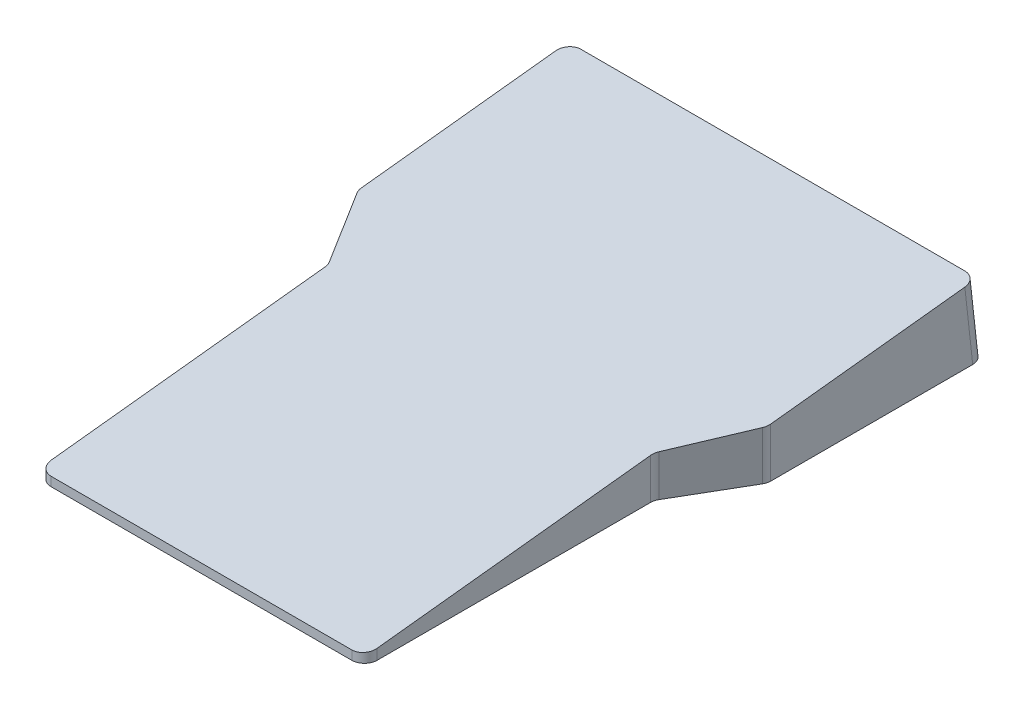
ISO-10303-21;
HEADER;
FILE_DESCRIPTION(('STEP AP214'),'2;1');
FILE_NAME('part.step','',(''),(''),'','','');
FILE_SCHEMA(('AUTOMOTIVE_DESIGN { 1 0 10303 214 1 1 1 1 }'));
ENDSEC;
DATA;
#1=APPLICATION_CONTEXT('core data for automotive mechanical design processes');
#2=APPLICATION_PROTOCOL_DEFINITION('international standard','automotive_design',2000,#1);
#3=PRODUCT_CONTEXT('',#1,'mechanical');
#4=PRODUCT('Part','Part','',(#3));
#5=PRODUCT_RELATED_PRODUCT_CATEGORY('part','',(#4));
#6=PRODUCT_DEFINITION_FORMATION('','',#4);
#7=PRODUCT_DEFINITION_CONTEXT('part definition',#1,'design');
#8=PRODUCT_DEFINITION('design','',#6,#7);
#9=PRODUCT_DEFINITION_SHAPE('','',#8);
#10=(LENGTH_UNIT() NAMED_UNIT(*) SI_UNIT(.MILLI.,.METRE.));
#11=(NAMED_UNIT(*) PLANE_ANGLE_UNIT() SI_UNIT($,.RADIAN.));
#12=(NAMED_UNIT(*) SI_UNIT($,.STERADIAN.) SOLID_ANGLE_UNIT());
#13=UNCERTAINTY_MEASURE_WITH_UNIT(LENGTH_MEASURE(1.E-05),#10,'distance_accuracy_value','');
#14=(GEOMETRIC_REPRESENTATION_CONTEXT(3) GLOBAL_UNCERTAINTY_ASSIGNED_CONTEXT((#13)) GLOBAL_UNIT_ASSIGNED_CONTEXT((#10,
#11,#12)) REPRESENTATION_CONTEXT('',''));
#15=CARTESIAN_POINT('',(0.,0.,0.));
#16=DIRECTION('',(0.,0.,1.));
#17=DIRECTION('',(1.,0.,0.));
#18=AXIS2_PLACEMENT_3D('',#15,#16,#17);
#19=CARTESIAN_POINT('',(0.,0.,0.));
#20=DIRECTION('',(0.,1.,0.));
#21=DIRECTION('',(0.,0.,1.));
#22=AXIS2_PLACEMENT_3D('',#19,#20,#21);
#23=PLANE('',#22);
#24=CARTESIAN_POINT('',(-49.597316240606,0.,6.94413092550791));
#25=DIRECTION('',(0.,1.,0.));
#26=DIRECTION('',(0.,0.,1.));
#27=AXIS2_PLACEMENT_3D('',#24,#25,#26);
#28=CIRCLE('',#27,2.35);
#29=CARTESIAN_POINT('',(-49.597316240606,0.,9.2941309255079));
#30=VERTEX_POINT('',#29);
#31=EDGE_CURVE('E286',#30,#30,#28,.F.);
#32=ORIENTED_EDGE('',*,*,#31,.F.);
#33=EDGE_LOOP('',(#32));
#34=FACE_BOUND('',#33,.T.);
#35=CARTESIAN_POINT('',(47.402683759394,0.,6.94413092550789));
#36=DIRECTION('',(0.,1.,0.));
#37=DIRECTION('',(0.,0.,1.));
#38=AXIS2_PLACEMENT_3D('',#35,#36,#37);
#39=CIRCLE('',#38,2.35);
#40=CARTESIAN_POINT('',(47.402683759394,0.,9.29413092550789));
#41=VERTEX_POINT('',#40);
#42=EDGE_CURVE('E457',#41,#41,#39,.F.);
#43=ORIENTED_EDGE('',*,*,#42,.F.);
#44=EDGE_LOOP('',(#43));
#45=FACE_BOUND('',#44,.T.);
#46=CARTESIAN_POINT('',(-21.847316240606,0.,-5.13086907449209));
#47=DIRECTION('',(0.,1.,0.));
#48=DIRECTION('',(0.,0.,1.));
#49=AXIS2_PLACEMENT_3D('',#46,#47,#48);
#50=CIRCLE('',#49,2.4);
#51=CARTESIAN_POINT('',(-21.847316240606,0.,-2.73086907449209));
#52=VERTEX_POINT('',#51);
#53=EDGE_CURVE('E453',#52,#52,#50,.F.);
#54=ORIENTED_EDGE('',*,*,#53,.F.);
#55=EDGE_LOOP('',(#54));
#56=FACE_BOUND('',#55,.T.);
#57=CARTESIAN_POINT('',(-31.847316240606,0.,-5.1308690744921));
#58=DIRECTION('',(0.,1.,0.));
#59=DIRECTION('',(0.,0.,1.));
#60=AXIS2_PLACEMENT_3D('',#57,#58,#59);
#61=CIRCLE('',#60,2.4);
#62=CARTESIAN_POINT('',(-31.847316240606,0.,-2.7308690744921));
#63=VERTEX_POINT('',#62);
#64=EDGE_CURVE('E449',#63,#63,#61,.F.);
#65=ORIENTED_EDGE('',*,*,#64,.F.);
#66=EDGE_LOOP('',(#65));
#67=FACE_BOUND('',#66,.T.);
#68=CARTESIAN_POINT('',(48.902683759394,0.,-45.3058690744921));
#69=DIRECTION('',(0.,1.,0.));
#70=DIRECTION('',(0.,0.,1.));
#71=AXIS2_PLACEMENT_3D('',#68,#69,#70);
#72=CIRCLE('',#71,2.4);
#73=CARTESIAN_POINT('',(48.902683759394,0.,-42.9058690744921));
#74=VERTEX_POINT('',#73);
#75=EDGE_CURVE('E445',#74,#74,#72,.F.);
#76=ORIENTED_EDGE('',*,*,#75,.F.);
#77=EDGE_LOOP('',(#76));
#78=FACE_BOUND('',#77,.T.);
#79=CARTESIAN_POINT('',(-51.097316240606,0.,-45.3058690744921));
#80=DIRECTION('',(0.,1.,0.));
#81=DIRECTION('',(0.,0.,1.));
#82=AXIS2_PLACEMENT_3D('',#79,#80,#81);
#83=CIRCLE('',#82,2.4);
#84=CARTESIAN_POINT('',(-51.097316240606,0.,-42.9058690744921));
#85=VERTEX_POINT('',#84);
#86=EDGE_CURVE('E441',#85,#85,#83,.F.);
#87=ORIENTED_EDGE('',*,*,#86,.F.);
#88=EDGE_LOOP('',(#87));
#89=FACE_BOUND('',#88,.T.);
#90=DIRECTION('',(1.,0.,0.));
#91=VECTOR('',#90,1.);
#92=CARTESIAN_POINT('',(0.,0.,-51.8058690744921));
#93=LINE('',#92,#91);
#94=CARTESIAN_POINT('',(-54.097316240606,0.,-51.8058690744921));
#95=VERTEX_POINT('',#94);
#96=CARTESIAN_POINT('',(51.902683759394,0.,-51.8058690744921));
#97=VERTEX_POINT('',#96);
#98=EDGE_CURVE('E253',#95,#97,#93,.T.);
#99=ORIENTED_EDGE('',*,*,#98,.T.);
#100=CARTESIAN_POINT('',(51.902683759394,0.,-48.2844070286295));
#101=DIRECTION('',(0.,1.,0.));
#102=DIRECTION('',(0.,0.,1.));
#103=AXIS2_PLACEMENT_3D('',#100,#101,#102);
#104=ELLIPSE('',#103,3.52146204586261,3.5);
#105=CARTESIAN_POINT('',(55.402683759394,0.,-48.2844070286295));
#106=VERTEX_POINT('',#105);
#107=EDGE_CURVE('E261',#97,#106,#104,.F.);
#108=ORIENTED_EDGE('',*,*,#107,.T.);
#109=DIRECTION('',(0.,0.,1.));
#110=VECTOR('',#109,1.);
#111=CARTESIAN_POINT('',(55.402683759394,0.,0.));
#112=LINE('',#111,#110);
#113=CARTESIAN_POINT('',(55.402683759394,0.,7.49938743866031));
#114=VERTEX_POINT('',#113);
#115=EDGE_CURVE('E273',#106,#114,#112,.T.);
#116=ORIENTED_EDGE('',*,*,#115,.T.);
#117=CARTESIAN_POINT('',(51.902683759394,0.,7.49938743866031));
#118=DIRECTION('',(0.,1.,0.));
#119=DIRECTION('',(0.,0.,1.));
#120=AXIS2_PLACEMENT_3D('',#117,#118,#119);
#121=CIRCLE('',#120,3.5);
#122=CARTESIAN_POINT('',(54.927297595843,0.,9.2605549889977));
#123=VERTEX_POINT('',#122);
#124=EDGE_CURVE('E283',#114,#123,#121,.F.);
#125=ORIENTED_EDGE('',*,*,#124,.T.);
#126=DIRECTION('',(0.503190728667824,0.,-0.864175381842566));
#127=VECTOR('',#126,1.);
#128=CARTESIAN_POINT('',(45.0465622981541,0.,26.2296438698113));
#129=LINE('',#128,#127);
#130=CARTESIAN_POINT('',(44.378069922945,0.,27.3777068620181));
#131=VERTEX_POINT('',#130);
#132=EDGE_CURVE('E376',#131,#123,#129,.T.);
#133=ORIENTED_EDGE('',*,*,#132,.F.);
#134=CARTESIAN_POINT('',(47.402683759394,0.,29.1388744123555));
#135=DIRECTION('',(0.,1.,0.));
#136=DIRECTION('',(0.,0.,1.));
#137=AXIS2_PLACEMENT_3D('',#134,#135,#136);
#138=CIRCLE('',#137,3.5);
#139=CARTESIAN_POINT('',(43.902683759394,0.,29.1388744123555));
#140=VERTEX_POINT('',#139);
#141=EDGE_CURVE('E146',#131,#140,#138,.T.);
#142=ORIENTED_EDGE('',*,*,#141,.T.);
#143=DIRECTION('',(0.,0.,1.));
#144=VECTOR('',#143,1.);
#145=CARTESIAN_POINT('',(43.902683759394,0.,0.));
#146=LINE('',#145,#144);
#147=CARTESIAN_POINT('',(43.902683759394,0.,104.694130925508));
#148=VERTEX_POINT('',#147);
#149=EDGE_CURVE('E375',#140,#148,#146,.T.);
#150=ORIENTED_EDGE('',*,*,#149,.T.);
#151=CARTESIAN_POINT('',(40.402683759394,0.,104.694130925508));
#152=DIRECTION('',(0.,1.,0.));
#153=DIRECTION('',(0.,0.,1.));
#154=AXIS2_PLACEMENT_3D('',#151,#152,#153);
#155=CIRCLE('',#154,3.5);
#156=CARTESIAN_POINT('',(40.402683759394,0.,108.194130925508));
#157=VERTEX_POINT('',#156);
#158=EDGE_CURVE('E292',#148,#157,#155,.F.);
#159=ORIENTED_EDGE('',*,*,#158,.T.);
#160=DIRECTION('',(1.,0.,0.));
#161=VECTOR('',#160,1.);
#162=CARTESIAN_POINT('',(0.,0.,108.194130925508));
#163=LINE('',#162,#161);
#164=CARTESIAN_POINT('',(-42.597316240606,0.,108.194130925508));
#165=VERTEX_POINT('',#164);
#166=EDGE_CURVE('E385',#165,#157,#163,.T.);
#167=ORIENTED_EDGE('',*,*,#166,.F.);
#168=CARTESIAN_POINT('',(-42.597316240606,0.,104.694130925508));
#169=DIRECTION('',(0.,1.,0.));
#170=DIRECTION('',(0.,0.,1.));
#171=AXIS2_PLACEMENT_3D('',#168,#169,#170);
#172=CIRCLE('',#171,3.5);
#173=CARTESIAN_POINT('',(-46.097316240606,0.,104.694130925508));
#174=VERTEX_POINT('',#173);
#175=EDGE_CURVE('E295',#165,#174,#172,.F.);
#176=ORIENTED_EDGE('',*,*,#175,.T.);
#177=DIRECTION('',(0.,0.,1.));
#178=VECTOR('',#177,1.);
#179=CARTESIAN_POINT('',(-46.097316240606,0.,0.));
#180=LINE('',#179,#178);
#181=CARTESIAN_POINT('',(-46.097316240606,0.,29.1388744123555));
#182=VERTEX_POINT('',#181);
#183=EDGE_CURVE('E432',#182,#174,#180,.T.);
#184=ORIENTED_EDGE('',*,*,#183,.F.);
#185=CARTESIAN_POINT('',(-49.597316240606,0.,29.1388744123555));
#186=DIRECTION('',(0.,1.,0.));
#187=DIRECTION('',(0.,0.,1.));
#188=AXIS2_PLACEMENT_3D('',#185,#186,#187);
#189=CIRCLE('',#188,3.5);
#190=CARTESIAN_POINT('',(-46.572702404157,0.,27.3777068620181));
#191=VERTEX_POINT('',#190);
#192=EDGE_CURVE('E366',#182,#191,#189,.T.);
#193=ORIENTED_EDGE('',*,*,#192,.T.);
#194=DIRECTION('',(0.503190728667823,0.,0.864175381842566));
#195=VECTOR('',#194,1.);
#196=CARTESIAN_POINT('',(-46.6855118392866,0.,27.1839689190783));
#197=LINE('',#196,#195);
#198=CARTESIAN_POINT('',(-57.121930077055,0.,9.2605549889977));
#199=VERTEX_POINT('',#198);
#200=EDGE_CURVE('E428',#199,#191,#197,.T.);
#201=ORIENTED_EDGE('',*,*,#200,.F.);
#202=CARTESIAN_POINT('',(-54.097316240606,0.,7.49938743866033));
#203=DIRECTION('',(0.,1.,0.));
#204=DIRECTION('',(0.,0.,1.));
#205=AXIS2_PLACEMENT_3D('',#202,#203,#204);
#206=CIRCLE('',#205,3.5);
#207=CARTESIAN_POINT('',(-57.597316240606,0.,7.49938743866033));
#208=VERTEX_POINT('',#207);
#209=EDGE_CURVE('E262',#199,#208,#206,.F.);
#210=ORIENTED_EDGE('',*,*,#209,.T.);
#211=DIRECTION('',(0.,0.,1.));
#212=VECTOR('',#211,1.);
#213=CARTESIAN_POINT('',(-57.597316240606,0.,0.));
#214=LINE('',#213,#212);
#215=CARTESIAN_POINT('',(-57.597316240606,0.,-48.2844070286295));
#216=VERTEX_POINT('',#215);
#217=EDGE_CURVE('E255',#216,#208,#214,.T.);
#218=ORIENTED_EDGE('',*,*,#217,.F.);
#219=CARTESIAN_POINT('',(-54.097316240606,0.,-48.2844070286295));
#220=DIRECTION('',(0.,1.,0.));
#221=DIRECTION('',(0.,0.,-1.));
#222=AXIS2_PLACEMENT_3D('',#219,#220,#221);
#223=ELLIPSE('',#222,3.52146204586261,3.5);
#224=EDGE_CURVE('E251',#216,#95,#223,.F.);
#225=ORIENTED_EDGE('',*,*,#224,.T.);
#226=EDGE_LOOP('',(#99,#108,#116,#125,#133,#142,#150,#159,#167,#176,#184,#193,#201,#210,#218,#225));
#227=FACE_BOUND('',#226,.T.);
#228=ADVANCED_FACE('F137',(#34,#45,#56,#67,#78,#89,#227),#23,.F.);
#229=CARTESIAN_POINT('',(45.0465622981541,20.,26.2296438698113));
#230=DIRECTION('',(-0.864175381842566,0.,-0.503190728667824));
#231=DIRECTION('',(-0.503190728667824,0.,0.864175381842566));
#232=AXIS2_PLACEMENT_3D('',#229,#230,#231);
#233=PLANE('',#232);
#234=DIRECTION('',(-0.500895165872153,-0.0954107678980578,0.860233002258697));
#235=VECTOR('',#234,1.);
#236=CARTESIAN_POINT('',(45.4484397145102,11.6674526644309,25.5394630895475));
#237=LINE('',#236,#235);
#238=CARTESIAN_POINT('',(54.927297595843,13.4729903714675,9.2605549889977));
#239=VERTEX_POINT('',#238);
#240=CARTESIAN_POINT('',(44.378069922945,11.463568077982,27.3777068620181));
#241=VERTEX_POINT('',#240);
#242=EDGE_CURVE('E389',#239,#241,#237,.T.);
#243=ORIENTED_EDGE('',*,*,#242,.T.);
#244=DIRECTION('',(0.,-1.,0.));
#245=VECTOR('',#244,1.);
#246=CARTESIAN_POINT('',(44.378069922945,20.,27.3777068620181));
#247=LINE('',#246,#245);
#248=EDGE_CURVE('E362',#241,#131,#247,.T.);
#249=ORIENTED_EDGE('',*,*,#248,.T.);
#250=ORIENTED_EDGE('',*,*,#132,.T.);
#251=DIRECTION('',(0.,-1.,0.));
#252=VECTOR('',#251,1.);
#253=CARTESIAN_POINT('',(54.927297595843,13.5635421715304,9.2605549889977));
#254=LINE('',#253,#252);
#255=EDGE_CURVE('E158',#123,#239,#254,.F.);
#256=ORIENTED_EDGE('',*,*,#255,.T.);
#257=EDGE_LOOP('',(#243,#249,#250,#256));
#258=FACE_BOUND('',#257,.T.);
#259=ADVANCED_FACE('F388',(#258),#233,.F.);
#260=CARTESIAN_POINT('',(-57.597316240606,20.,0.));
#261=DIRECTION('',(1.,0.,0.));
#262=DIRECTION('',(0.,0.,-1.));
#263=AXIS2_PLACEMENT_3D('',#260,#261,#262);
#264=PLANE('',#263);
#265=DIRECTION('',(0.,0.110236730398686,-0.993905359312952));
#266=VECTOR('',#265,1.);
#267=CARTESIAN_POINT('',(-57.5973162406061,14.3238963199093,1.58870206512229));
#268=LINE('',#267,#266);
#269=CARTESIAN_POINT('',(-57.5973162406061,13.6683262257461,7.49938743866033));
#270=VERTEX_POINT('',#269);
#271=CARTESIAN_POINT('',(-57.5973162406061,19.6141714436046,-46.1089462474171));
#272=VERTEX_POINT('',#271);
#273=EDGE_CURVE('E553',#270,#272,#268,.T.);
#274=ORIENTED_EDGE('',*,*,#273,.T.);
#275=DIRECTION('',(0.,-0.993905359312952,-0.110236730398682));
#276=VECTOR('',#275,1.);
#277=CARTESIAN_POINT('',(-57.597316240606,25.0472323891153,-45.5063507698115));
#278=LINE('',#277,#276);
#279=EDGE_CURVE('E329',#272,#216,#278,.T.);
#280=ORIENTED_EDGE('',*,*,#279,.T.);
#281=ORIENTED_EDGE('',*,*,#217,.T.);
#282=DIRECTION('',(0.,-1.,0.));
#283=VECTOR('',#282,1.);
#284=CARTESIAN_POINT('',(-57.597316240606,20.,7.49938743866033));
#285=LINE('',#284,#283);
#286=EDGE_CURVE('E326',#208,#270,#285,.F.);
#287=ORIENTED_EDGE('',*,*,#286,.T.);
#288=EDGE_LOOP('',(#274,#280,#281,#287));
#289=FACE_BOUND('',#288,.T.);
#290=ADVANCED_FACE('F498',(#289),#264,.F.);
#291=CARTESIAN_POINT('',(55.402683759394,20.,0.));
#292=DIRECTION('',(1.,0.,0.));
#293=DIRECTION('',(0.,0.,-1.));
#294=AXIS2_PLACEMENT_3D('',#291,#292,#293);
#295=PLANE('',#294);
#296=ORIENTED_EDGE('',*,*,#115,.F.);
#297=DIRECTION('',(0.,-0.993905359312952,-0.110236730398682));
#298=VECTOR('',#297,1.);
#299=CARTESIAN_POINT('',(55.402683759394,19.6141714436046,-46.1089462474171));
#300=LINE('',#299,#298);
#301=CARTESIAN_POINT('',(55.402683759394,19.6141714436046,-46.1089462474171));
#302=VERTEX_POINT('',#301);
#303=EDGE_CURVE('E306',#106,#302,#300,.F.);
#304=ORIENTED_EDGE('',*,*,#303,.T.);
#305=DIRECTION('',(0.,0.110236730398686,-0.993905359312952));
#306=VECTOR('',#305,1.);
#307=CARTESIAN_POINT('',(55.402683759394,14.3238963199093,1.58870206512224));
#308=LINE('',#307,#306);
#309=CARTESIAN_POINT('',(55.402683759394,13.6683262257461,7.49938743866031));
#310=VERTEX_POINT('',#309);
#311=EDGE_CURVE('E548',#310,#302,#308,.T.);
#312=ORIENTED_EDGE('',*,*,#311,.F.);
#313=DIRECTION('',(0.,-1.,0.));
#314=VECTOR('',#313,1.);
#315=CARTESIAN_POINT('',(55.402683759394,0.,7.49938743866031));
#316=LINE('',#315,#314);
#317=EDGE_CURVE('E302',#310,#114,#316,.T.);
#318=ORIENTED_EDGE('',*,*,#317,.T.);
#319=EDGE_LOOP('',(#296,#304,#312,#318));
#320=FACE_BOUND('',#319,.T.);
#321=ADVANCED_FACE('F485',(#320),#295,.T.);
#322=CARTESIAN_POINT('',(-46.097316240606,20.,0.));
#323=DIRECTION('',(1.,0.,0.));
#324=DIRECTION('',(0.,0.,-1.));
#325=AXIS2_PLACEMENT_3D('',#322,#323,#324);
#326=PLANE('',#325);
#327=DIRECTION('',(0.,0.110236730398686,-0.993905359312952));
#328=VECTOR('',#327,1.);
#329=CARTESIAN_POINT('',(-46.097316240606,14.5669390544892,-0.602595477605541));
#330=LINE('',#329,#328);
#331=CARTESIAN_POINT('',(-46.097316240606,2.88819446215896,104.694130925508));
#332=VERTEX_POINT('',#331);
#333=CARTESIAN_POINT('',(-46.097316240606,11.2682322237034,29.1388744123555));
#334=VERTEX_POINT('',#333);
#335=EDGE_CURVE('E400',#332,#334,#330,.T.);
#336=ORIENTED_EDGE('',*,*,#335,.T.);
#337=DIRECTION('',(0.,-1.,0.));
#338=VECTOR('',#337,1.);
#339=CARTESIAN_POINT('',(-46.097316240606,0.,29.1388744123555));
#340=LINE('',#339,#338);
#341=EDGE_CURVE('E342',#334,#182,#340,.T.);
#342=ORIENTED_EDGE('',*,*,#341,.T.);
#343=ORIENTED_EDGE('',*,*,#183,.T.);
#344=DIRECTION('',(0.,-1.,0.));
#345=VECTOR('',#344,1.);
#346=CARTESIAN_POINT('',(-46.097316240606,20.,104.694130925508));
#347=LINE('',#346,#345);
#348=EDGE_CURVE('E339',#174,#332,#347,.F.);
#349=ORIENTED_EDGE('',*,*,#348,.T.);
#350=EDGE_LOOP('',(#336,#342,#343,#349));
#351=FACE_BOUND('',#350,.T.);
#352=ADVANCED_FACE('F497',(#351),#326,.F.);
#353=CARTESIAN_POINT('',(0.,20.,108.194130925508));
#354=DIRECTION('',(0.,0.,-1.));
#355=DIRECTION('',(-1.,0.,0.));
#356=AXIS2_PLACEMENT_3D('',#353,#354,#355);
#357=PLANE('',#356);
#358=DIRECTION('',(1.,0.,0.));
#359=VECTOR('',#358,1.);
#360=CARTESIAN_POINT('',(-57.597316240606,2.5,108.194130925508));
#361=LINE('',#360,#359);
#362=CARTESIAN_POINT('',(-42.597316240606,2.5,108.194130925508));
#363=VERTEX_POINT('',#362);
#364=CARTESIAN_POINT('',(40.402683759394,2.5,108.194130925508));
#365=VERTEX_POINT('',#364);
#366=EDGE_CURVE('E560',#363,#365,#361,.T.);
#367=ORIENTED_EDGE('',*,*,#366,.F.);
#368=DIRECTION('',(0.,-1.,0.));
#369=VECTOR('',#368,1.);
#370=CARTESIAN_POINT('',(-42.597316240606,20.,108.194130925508));
#371=LINE('',#370,#369);
#372=EDGE_CURVE('E349',#363,#165,#371,.T.);
#373=ORIENTED_EDGE('',*,*,#372,.T.);
#374=ORIENTED_EDGE('',*,*,#166,.T.);
#375=DIRECTION('',(0.,-1.,0.));
#376=VECTOR('',#375,1.);
#377=CARTESIAN_POINT('',(40.402683759394,2.5,108.194130925508));
#378=LINE('',#377,#376);
#379=EDGE_CURVE('E346',#157,#365,#378,.F.);
#380=ORIENTED_EDGE('',*,*,#379,.T.);
#381=EDGE_LOOP('',(#367,#373,#374,#380));
#382=FACE_BOUND('',#381,.T.);
#383=ADVANCED_FACE('F502',(#382),#357,.F.);
#384=CARTESIAN_POINT('',(43.902683759394,20.,0.));
#385=DIRECTION('',(1.,0.,0.));
#386=DIRECTION('',(0.,0.,-1.));
#387=AXIS2_PLACEMENT_3D('',#384,#385,#386);
#388=PLANE('',#387);
#389=DIRECTION('',(0.,0.110236730398686,-0.993905359312952));
#390=VECTOR('',#389,1.);
#391=CARTESIAN_POINT('',(43.902683759394,14.5669390544892,-0.602595477605557));
#392=LINE('',#391,#390);
#393=CARTESIAN_POINT('',(43.902683759394,2.88819446215896,104.694130925508));
#394=VERTEX_POINT('',#393);
#395=CARTESIAN_POINT('',(43.902683759394,11.2682322237034,29.1388744123555));
#396=VERTEX_POINT('',#395);
#397=EDGE_CURVE('E393',#394,#396,#392,.T.);
#398=ORIENTED_EDGE('',*,*,#397,.F.);
#399=DIRECTION('',(0.,-1.,0.));
#400=VECTOR('',#399,1.);
#401=CARTESIAN_POINT('',(43.902683759394,0.,104.694130925508));
#402=LINE('',#401,#400);
#403=EDGE_CURVE('E356',#394,#148,#402,.T.);
#404=ORIENTED_EDGE('',*,*,#403,.T.);
#405=ORIENTED_EDGE('',*,*,#149,.F.);
#406=DIRECTION('',(0.,-1.,0.));
#407=VECTOR('',#406,1.);
#408=CARTESIAN_POINT('',(43.902683759394,20.,29.1388744123555));
#409=LINE('',#408,#407);
#410=EDGE_CURVE('E353',#140,#396,#409,.F.);
#411=ORIENTED_EDGE('',*,*,#410,.T.);
#412=EDGE_LOOP('',(#398,#404,#405,#411));
#413=FACE_BOUND('',#412,.T.);
#414=ADVANCED_FACE('F382',(#413),#388,.T.);
#415=CARTESIAN_POINT('',(-46.6855118392866,20.,27.1839689190783));
#416=DIRECTION('',(0.864175381842566,0.,-0.503190728667823));
#417=DIRECTION('',(-0.503190728667823,0.,-0.864175381842566));
#418=AXIS2_PLACEMENT_3D('',#415,#416,#417);
#419=PLANE('',#418);
#420=DIRECTION('',(-0.500895165872153,0.0954107678980579,-0.860233002258697));
#421=VECTOR('',#420,1.);
#422=CARTESIAN_POINT('',(-47.092447756713,11.5625694391,26.4851007130633));
#423=LINE('',#422,#421);
#424=CARTESIAN_POINT('',(-46.572702404157,11.463568077982,27.3777068620181));
#425=VERTEX_POINT('',#424);
#426=CARTESIAN_POINT('',(-57.121930077055,13.4729903714675,9.2605549889977));
#427=VERTEX_POINT('',#426);
#428=EDGE_CURVE('E279',#425,#427,#423,.T.);
#429=ORIENTED_EDGE('',*,*,#428,.T.);
#430=DIRECTION('',(0.,-1.,0.));
#431=VECTOR('',#430,1.);
#432=CARTESIAN_POINT('',(-57.121930077055,20.,9.2605549889977));
#433=LINE('',#432,#431);
#434=EDGE_CURVE('E335',#427,#199,#433,.T.);
#435=ORIENTED_EDGE('',*,*,#434,.T.);
#436=ORIENTED_EDGE('',*,*,#200,.T.);
#437=DIRECTION('',(0.,-1.,0.));
#438=VECTOR('',#437,1.);
#439=CARTESIAN_POINT('',(-46.572702404157,11.3730162779191,27.3777068620181));
#440=LINE('',#439,#438);
#441=EDGE_CURVE('E332',#191,#425,#440,.F.);
#442=ORIENTED_EDGE('',*,*,#441,.T.);
#443=EDGE_LOOP('',(#429,#435,#436,#442));
#444=FACE_BOUND('',#443,.T.);
#445=ADVANCED_FACE('F469',(#444),#419,.F.);
#446=CARTESIAN_POINT('',(-51.097316240606,-3.,-45.3058690744921));
#447=DIRECTION('',(0.,1.,0.));
#448=DIRECTION('',(0.,0.,1.));
#449=AXIS2_PLACEMENT_3D('',#446,#447,#448);
#450=CYLINDRICAL_SURFACE('',#449,2.4);
#451=CARTESIAN_POINT('',(-51.097316240606,-3.,-45.3058690744921));
#452=DIRECTION('',(0.,-1.,0.));
#453=DIRECTION('',(0.,0.,-1.));
#454=AXIS2_PLACEMENT_3D('',#451,#452,#453);
#455=CIRCLE('',#454,2.4);
#456=CARTESIAN_POINT('',(-51.097316240606,-3.,-47.7058690744921));
#457=VERTEX_POINT('',#456);
#458=EDGE_CURVE('E419',#457,#457,#455,.T.);
#459=ORIENTED_EDGE('',*,*,#458,.F.);
#460=EDGE_LOOP('',(#459));
#461=FACE_BOUND('',#460,.T.);
#462=ORIENTED_EDGE('',*,*,#86,.T.);
#463=EDGE_LOOP('',(#462));
#464=FACE_BOUND('',#463,.T.);
#465=ADVANCED_FACE('F480',(#461,#464),#450,.T.);
#466=CARTESIAN_POINT('',(-51.097316240606,-3.,-45.3058690744921));
#467=DIRECTION('',(0.,-1.,0.));
#468=DIRECTION('',(0.,0.,-1.));
#469=AXIS2_PLACEMENT_3D('',#466,#467,#468);
#470=PLANE('',#469);
#471=ORIENTED_EDGE('',*,*,#458,.T.);
#472=EDGE_LOOP('',(#471));
#473=FACE_BOUND('',#472,.T.);
#474=ADVANCED_FACE('F482',(#473),#470,.T.);
#475=CARTESIAN_POINT('',(48.902683759394,-3.,-45.3058690744921));
#476=DIRECTION('',(0.,1.,0.));
#477=DIRECTION('',(0.,0.,1.));
#478=AXIS2_PLACEMENT_3D('',#475,#476,#477);
#479=CYLINDRICAL_SURFACE('',#478,2.4);
#480=CARTESIAN_POINT('',(48.902683759394,-3.,-45.3058690744921));
#481=DIRECTION('',(0.,-1.,0.));
#482=DIRECTION('',(0.,0.,-1.));
#483=AXIS2_PLACEMENT_3D('',#480,#481,#482);
#484=CIRCLE('',#483,2.4);
#485=CARTESIAN_POINT('',(48.902683759394,-3.,-47.7058690744921));
#486=VERTEX_POINT('',#485);
#487=EDGE_CURVE('E415',#486,#486,#484,.T.);
#488=ORIENTED_EDGE('',*,*,#487,.F.);
#489=EDGE_LOOP('',(#488));
#490=FACE_BOUND('',#489,.T.);
#491=ORIENTED_EDGE('',*,*,#75,.T.);
#492=EDGE_LOOP('',(#491));
#493=FACE_BOUND('',#492,.T.);
#494=ADVANCED_FACE('F489',(#490,#493),#479,.T.);
#495=CARTESIAN_POINT('',(48.902683759394,-3.,-45.3058690744921));
#496=DIRECTION('',(0.,-1.,0.));
#497=DIRECTION('',(0.,0.,-1.));
#498=AXIS2_PLACEMENT_3D('',#495,#496,#497);
#499=PLANE('',#498);
#500=ORIENTED_EDGE('',*,*,#487,.T.);
#501=EDGE_LOOP('',(#500));
#502=FACE_BOUND('',#501,.T.);
#503=ADVANCED_FACE('F618',(#502),#499,.T.);
#504=CARTESIAN_POINT('',(-31.847316240606,-3.,-5.1308690744921));
#505=DIRECTION('',(0.,1.,0.));
#506=DIRECTION('',(0.,0.,1.));
#507=AXIS2_PLACEMENT_3D('',#504,#505,#506);
#508=CYLINDRICAL_SURFACE('',#507,2.4);
#509=CARTESIAN_POINT('',(-31.847316240606,-3.,-5.1308690744921));
#510=DIRECTION('',(0.,-1.,0.));
#511=DIRECTION('',(0.,0.,-1.));
#512=AXIS2_PLACEMENT_3D('',#509,#510,#511);
#513=CIRCLE('',#512,2.4);
#514=CARTESIAN_POINT('',(-31.847316240606,-3.,-7.5308690744921));
#515=VERTEX_POINT('',#514);
#516=EDGE_CURVE('E411',#515,#515,#513,.T.);
#517=ORIENTED_EDGE('',*,*,#516,.F.);
#518=EDGE_LOOP('',(#517));
#519=FACE_BOUND('',#518,.T.);
#520=ORIENTED_EDGE('',*,*,#64,.T.);
#521=EDGE_LOOP('',(#520));
#522=FACE_BOUND('',#521,.T.);
#523=ADVANCED_FACE('F615',(#519,#522),#508,.T.);
#524=CARTESIAN_POINT('',(-31.847316240606,-3.,-5.1308690744921));
#525=DIRECTION('',(0.,-1.,0.));
#526=DIRECTION('',(0.,0.,-1.));
#527=AXIS2_PLACEMENT_3D('',#524,#525,#526);
#528=PLANE('',#527);
#529=ORIENTED_EDGE('',*,*,#516,.T.);
#530=EDGE_LOOP('',(#529));
#531=FACE_BOUND('',#530,.T.);
#532=ADVANCED_FACE('F610',(#531),#528,.T.);
#533=CARTESIAN_POINT('',(-21.847316240606,-3.,-5.13086907449209));
#534=DIRECTION('',(0.,1.,0.));
#535=DIRECTION('',(0.,0.,1.));
#536=AXIS2_PLACEMENT_3D('',#533,#534,#535);
#537=CYLINDRICAL_SURFACE('',#536,2.4);
#538=CARTESIAN_POINT('',(-21.847316240606,-3.,-5.13086907449209));
#539=DIRECTION('',(0.,-1.,0.));
#540=DIRECTION('',(0.,0.,-1.));
#541=AXIS2_PLACEMENT_3D('',#538,#539,#540);
#542=CIRCLE('',#541,2.4);
#543=CARTESIAN_POINT('',(-21.847316240606,-3.,-7.53086907449209));
#544=VERTEX_POINT('',#543);
#545=EDGE_CURVE('E407',#544,#544,#542,.T.);
#546=ORIENTED_EDGE('',*,*,#545,.F.);
#547=EDGE_LOOP('',(#546));
#548=FACE_BOUND('',#547,.T.);
#549=ORIENTED_EDGE('',*,*,#53,.T.);
#550=EDGE_LOOP('',(#549));
#551=FACE_BOUND('',#550,.T.);
#552=ADVANCED_FACE('F607',(#548,#551),#537,.T.);
#553=CARTESIAN_POINT('',(-21.847316240606,-3.,-5.13086907449209));
#554=DIRECTION('',(0.,-1.,0.));
#555=DIRECTION('',(0.,0.,-1.));
#556=AXIS2_PLACEMENT_3D('',#553,#554,#555);
#557=PLANE('',#556);
#558=ORIENTED_EDGE('',*,*,#545,.T.);
#559=EDGE_LOOP('',(#558));
#560=FACE_BOUND('',#559,.T.);
#561=ADVANCED_FACE('F602',(#560),#557,.T.);
#562=CARTESIAN_POINT('',(47.402683759394,-3.,6.94413092550789));
#563=DIRECTION('',(0.,1.,0.));
#564=DIRECTION('',(0.,0.,1.));
#565=AXIS2_PLACEMENT_3D('',#562,#563,#564);
#566=CYLINDRICAL_SURFACE('',#565,2.35);
#567=CARTESIAN_POINT('',(47.402683759394,-3.,6.94413092550789));
#568=DIRECTION('',(0.,-1.,0.));
#569=DIRECTION('',(0.,0.,-1.));
#570=AXIS2_PLACEMENT_3D('',#567,#568,#569);
#571=CIRCLE('',#570,2.35);
#572=CARTESIAN_POINT('',(47.402683759394,-3.,4.5941309255079));
#573=VERTEX_POINT('',#572);
#574=EDGE_CURVE('E398',#573,#573,#571,.T.);
#575=ORIENTED_EDGE('',*,*,#574,.F.);
#576=EDGE_LOOP('',(#575));
#577=FACE_BOUND('',#576,.T.);
#578=ORIENTED_EDGE('',*,*,#42,.T.);
#579=EDGE_LOOP('',(#578));
#580=FACE_BOUND('',#579,.T.);
#581=ADVANCED_FACE('F599',(#577,#580),#566,.T.);
#582=CARTESIAN_POINT('',(47.402683759394,-3.,6.94413092550789));
#583=DIRECTION('',(0.,-1.,0.));
#584=DIRECTION('',(0.,0.,-1.));
#585=AXIS2_PLACEMENT_3D('',#582,#583,#584);
#586=PLANE('',#585);
#587=ORIENTED_EDGE('',*,*,#574,.T.);
#588=EDGE_LOOP('',(#587));
#589=FACE_BOUND('',#588,.T.);
#590=ADVANCED_FACE('F596',(#589),#586,.T.);
#591=CARTESIAN_POINT('',(-49.597316240606,-3.,6.94413092550791));
#592=DIRECTION('',(0.,1.,0.));
#593=DIRECTION('',(0.,0.,1.));
#594=AXIS2_PLACEMENT_3D('',#591,#592,#593);
#595=CYLINDRICAL_SURFACE('',#594,2.35);
#596=CARTESIAN_POINT('',(-49.597316240606,-3.,6.94413092550791));
#597=DIRECTION('',(0.,-1.,0.));
#598=DIRECTION('',(0.,0.,-1.));
#599=AXIS2_PLACEMENT_3D('',#596,#597,#598);
#600=CIRCLE('',#599,2.35);
#601=CARTESIAN_POINT('',(-49.597316240606,-3.,4.59413092550791));
#602=VERTEX_POINT('',#601);
#603=EDGE_CURVE('E392',#602,#602,#600,.T.);
#604=ORIENTED_EDGE('',*,*,#603,.F.);
#605=EDGE_LOOP('',(#604));
#606=FACE_BOUND('',#605,.T.);
#607=ORIENTED_EDGE('',*,*,#31,.T.);
#608=EDGE_LOOP('',(#607));
#609=FACE_BOUND('',#608,.T.);
#610=ADVANCED_FACE('F464',(#606,#609),#595,.T.);
#611=CARTESIAN_POINT('',(-49.597316240606,-3.,6.94413092550791));
#612=DIRECTION('',(0.,-1.,0.));
#613=DIRECTION('',(0.,0.,-1.));
#614=AXIS2_PLACEMENT_3D('',#611,#612,#613);
#615=PLANE('',#614);
#616=ORIENTED_EDGE('',*,*,#603,.T.);
#617=EDGE_LOOP('',(#616));
#618=FACE_BOUND('',#617,.T.);
#619=ADVANCED_FACE('F585',(#618),#615,.T.);
#620=CARTESIAN_POINT('',(-57.5973162406061,14.3238963199093,1.58870206512229));
#621=DIRECTION('',(0.,-0.993905359312952,-0.110236730398685));
#622=DIRECTION('',(0.,0.110236730398686,-0.993905359312952));
#623=AXIS2_PLACEMENT_3D('',#620,#621,#622);
#624=PLANE('',#623);
#625=ORIENTED_EDGE('',*,*,#311,.T.);
#626=CARTESIAN_POINT('',(51.902683759394,19.6141714436046,-46.1089462474171));
#627=DIRECTION('',(0.,-0.993905359312952,-0.110236730398685));
#628=DIRECTION('',(0.,0.110236730398686,-0.993905359312952));
#629=AXIS2_PLACEMENT_3D('',#626,#627,#628);
#630=CIRCLE('',#629,3.5);
#631=CARTESIAN_POINT('',(51.902683759394,20.,-49.5876150050124));
#632=VERTEX_POINT('',#631);
#633=EDGE_CURVE('E323',#302,#632,#630,.F.);
#634=ORIENTED_EDGE('',*,*,#633,.T.);
#635=DIRECTION('',(1.,0.,0.));
#636=VECTOR('',#635,1.);
#637=CARTESIAN_POINT('',(-57.5973162406061,20.,-49.5876150050124));
#638=LINE('',#637,#636);
#639=CARTESIAN_POINT('',(-54.097316240606,20.,-49.5876150050124));
#640=VERTEX_POINT('',#639);
#641=EDGE_CURVE('E557',#640,#632,#638,.T.);
#642=ORIENTED_EDGE('',*,*,#641,.F.);
#643=CARTESIAN_POINT('',(-54.097316240606,19.6141714436046,-46.108946247417));
#644=DIRECTION('',(0.,-0.993905359312952,-0.110236730398685));
#645=DIRECTION('',(0.,0.110236730398686,-0.993905359312952));
#646=AXIS2_PLACEMENT_3D('',#643,#644,#645);
#647=CIRCLE('',#646,3.5);
#648=EDGE_CURVE('E277',#640,#272,#647,.F.);
#649=ORIENTED_EDGE('',*,*,#648,.T.);
#650=ORIENTED_EDGE('',*,*,#273,.F.);
#651=CARTESIAN_POINT('',(-54.097316240606,13.6683262257461,7.49938743866033));
#652=DIRECTION('',(0.,-0.993905359312952,-0.110236730398685));
#653=DIRECTION('',(0.,-0.110236730398686,0.993905359312952));
#654=AXIS2_PLACEMENT_3D('',#651,#652,#653);
#655=ELLIPSE('',#654,3.52146204586261,3.5);
#656=EDGE_CURVE('E318',#270,#427,#655,.F.);
#657=ORIENTED_EDGE('',*,*,#656,.T.);
#658=ORIENTED_EDGE('',*,*,#428,.F.);
#659=CARTESIAN_POINT('',(-49.597316240606,11.2682322237034,29.1388744123555));
#660=DIRECTION('',(0.,-0.993905359312952,-0.110236730398685));
#661=DIRECTION('',(0.,0.110236730398686,-0.993905359312952));
#662=AXIS2_PLACEMENT_3D('',#659,#660,#661);
#663=ELLIPSE('',#662,3.52146204586261,3.5);
#664=EDGE_CURVE('E369',#425,#334,#663,.T.);
#665=ORIENTED_EDGE('',*,*,#664,.T.);
#666=ORIENTED_EDGE('',*,*,#335,.F.);
#667=CARTESIAN_POINT('',(-42.597316240606,2.88819446215896,104.694130925508));
#668=DIRECTION('',(0.,-0.993905359312952,-0.110236730398685));
#669=DIRECTION('',(0.,-0.110236730398686,0.993905359312952));
#670=AXIS2_PLACEMENT_3D('',#667,#668,#669);
#671=ELLIPSE('',#670,3.52146204586261,3.5);
#672=EDGE_CURVE('E315',#332,#363,#671,.F.);
#673=ORIENTED_EDGE('',*,*,#672,.T.);
#674=ORIENTED_EDGE('',*,*,#366,.T.);
#675=CARTESIAN_POINT('',(40.402683759394,2.88819446215896,104.694130925508));
#676=DIRECTION('',(0.,-0.993905359312952,-0.110236730398685));
#677=DIRECTION('',(0.,0.110236730398686,-0.993905359312952));
#678=AXIS2_PLACEMENT_3D('',#675,#676,#677);
#679=ELLIPSE('',#678,3.52146204586261,3.5);
#680=EDGE_CURVE('E312',#365,#394,#679,.F.);
#681=ORIENTED_EDGE('',*,*,#680,.T.);
#682=ORIENTED_EDGE('',*,*,#397,.T.);
#683=CARTESIAN_POINT('',(47.402683759394,11.2682322237034,29.1388744123555));
#684=DIRECTION('',(0.,-0.993905359312952,-0.110236730398685));
#685=DIRECTION('',(0.,-0.110236730398686,0.993905359312952));
#686=AXIS2_PLACEMENT_3D('',#683,#684,#685);
#687=ELLIPSE('',#686,3.52146204586261,3.5);
#688=EDGE_CURVE('E12',#396,#241,#687,.T.);
#689=ORIENTED_EDGE('',*,*,#688,.T.);
#690=ORIENTED_EDGE('',*,*,#242,.F.);
#691=CARTESIAN_POINT('',(51.902683759394,13.6683262257461,7.49938743866031));
#692=DIRECTION('',(0.,-0.993905359312952,-0.110236730398685));
#693=DIRECTION('',(0.,0.110236730398686,-0.993905359312952));
#694=AXIS2_PLACEMENT_3D('',#691,#692,#693);
#695=ELLIPSE('',#694,3.52146204586261,3.5);
#696=EDGE_CURVE('E309',#239,#310,#695,.F.);
#697=ORIENTED_EDGE('',*,*,#696,.T.);
#698=EDGE_LOOP('',(#625,#634,#642,#649,#650,#657,#658,#665,#666,#673,#674,#681,#682,#689,#690,#697));
#699=FACE_BOUND('',#698,.T.);
#700=ADVANCED_FACE('F547',(#699),#624,.F.);
#701=CARTESIAN_POINT('',(-57.5973162406061,5.67610368009048,-51.1763170701346));
#702=DIRECTION('',(0.,-0.110236730398682,0.993905359312952));
#703=DIRECTION('',(0.,-0.993905359312952,-0.110236730398682));
#704=AXIS2_PLACEMENT_3D('',#701,#702,#703);
#705=PLANE('',#704);
#706=ORIENTED_EDGE('',*,*,#641,.T.);
#707=DIRECTION('',(0.,-0.993905359312952,-0.110236730398682));
#708=VECTOR('',#707,1.);
#709=CARTESIAN_POINT('',(51.902683759394,0.,-51.8058690744921));
#710=LINE('',#709,#708);
#711=EDGE_CURVE('E271',#632,#97,#710,.T.);
#712=ORIENTED_EDGE('',*,*,#711,.T.);
#713=ORIENTED_EDGE('',*,*,#98,.F.);
#714=DIRECTION('',(0.,-0.993905359312952,-0.110236730398682));
#715=VECTOR('',#714,1.);
#716=CARTESIAN_POINT('',(-54.097316240606,5.67610368009048,-51.1763170701346));
#717=LINE('',#716,#715);
#718=EDGE_CURVE('E268',#95,#640,#717,.F.);
#719=ORIENTED_EDGE('',*,*,#718,.T.);
#720=EDGE_LOOP('',(#706,#712,#713,#719));
#721=FACE_BOUND('',#720,.T.);
#722=ADVANCED_FACE('F267',(#721),#705,.F.);
#723=CARTESIAN_POINT('',(51.902683759394,5.2902751236951,-47.6976483125393));
#724=DIRECTION('',(0.,0.993905359312952,0.110236730398682));
#725=DIRECTION('',(0.,-0.110236730398682,0.993905359312952));
#726=AXIS2_PLACEMENT_3D('',#723,#724,#725);
#727=CYLINDRICAL_SURFACE('',#726,3.5);
#728=ORIENTED_EDGE('',*,*,#633,.F.);
#729=ORIENTED_EDGE('',*,*,#303,.F.);
#730=ORIENTED_EDGE('',*,*,#107,.F.);
#731=ORIENTED_EDGE('',*,*,#711,.F.);
#732=EDGE_LOOP('',(#728,#729,#730,#731));
#733=FACE_BOUND('',#732,.T.);
#734=ADVANCED_FACE('F516',(#733),#727,.T.);
#735=CARTESIAN_POINT('',(-54.097316240606,25.0472323891153,-45.5063507698115));
#736=DIRECTION('',(0.,-0.993905359312952,-0.110236730398682));
#737=DIRECTION('',(0.,0.110236730398682,-0.993905359312952));
#738=AXIS2_PLACEMENT_3D('',#735,#736,#737);
#739=CYLINDRICAL_SURFACE('',#738,3.5);
#740=ORIENTED_EDGE('',*,*,#648,.F.);
#741=ORIENTED_EDGE('',*,*,#718,.F.);
#742=ORIENTED_EDGE('',*,*,#224,.F.);
#743=ORIENTED_EDGE('',*,*,#279,.F.);
#744=EDGE_LOOP('',(#740,#741,#742,#743));
#745=FACE_BOUND('',#744,.T.);
#746=ADVANCED_FACE('F276',(#745),#739,.T.);
#747=CARTESIAN_POINT('',(-54.097316240606,20.,7.49938743866033));
#748=DIRECTION('',(0.,-1.,0.));
#749=DIRECTION('',(0.,0.,-1.));
#750=AXIS2_PLACEMENT_3D('',#747,#748,#749);
#751=CYLINDRICAL_SURFACE('',#750,3.5);
#752=ORIENTED_EDGE('',*,*,#656,.F.);
#753=ORIENTED_EDGE('',*,*,#286,.F.);
#754=ORIENTED_EDGE('',*,*,#209,.F.);
#755=ORIENTED_EDGE('',*,*,#434,.F.);
#756=EDGE_LOOP('',(#752,#753,#754,#755));
#757=FACE_BOUND('',#756,.T.);
#758=ADVANCED_FACE('F522',(#757),#751,.T.);
#759=CARTESIAN_POINT('',(-49.597316240606,20.,29.1388744123555));
#760=DIRECTION('',(0.,1.,0.));
#761=DIRECTION('',(0.,0.,1.));
#762=AXIS2_PLACEMENT_3D('',#759,#760,#761);
#763=CYLINDRICAL_SURFACE('',#762,3.5);
#764=ORIENTED_EDGE('',*,*,#664,.F.);
#765=ORIENTED_EDGE('',*,*,#441,.F.);
#766=ORIENTED_EDGE('',*,*,#192,.F.);
#767=ORIENTED_EDGE('',*,*,#341,.F.);
#768=EDGE_LOOP('',(#764,#765,#766,#767));
#769=FACE_BOUND('',#768,.T.);
#770=ADVANCED_FACE('F525',(#769),#763,.F.);
#771=CARTESIAN_POINT('',(-42.597316240606,20.,104.694130925508));
#772=DIRECTION('',(0.,-1.,0.));
#773=DIRECTION('',(0.,0.,-1.));
#774=AXIS2_PLACEMENT_3D('',#771,#772,#773);
#775=CYLINDRICAL_SURFACE('',#774,3.5);
#776=ORIENTED_EDGE('',*,*,#672,.F.);
#777=ORIENTED_EDGE('',*,*,#348,.F.);
#778=ORIENTED_EDGE('',*,*,#175,.F.);
#779=ORIENTED_EDGE('',*,*,#372,.F.);
#780=EDGE_LOOP('',(#776,#777,#778,#779));
#781=FACE_BOUND('',#780,.T.);
#782=ADVANCED_FACE('F529',(#781),#775,.T.);
#783=CARTESIAN_POINT('',(40.402683759394,20.,104.694130925508));
#784=DIRECTION('',(0.,1.,0.));
#785=DIRECTION('',(0.,0.,1.));
#786=AXIS2_PLACEMENT_3D('',#783,#784,#785);
#787=CYLINDRICAL_SURFACE('',#786,3.5);
#788=ORIENTED_EDGE('',*,*,#680,.F.);
#789=ORIENTED_EDGE('',*,*,#379,.F.);
#790=ORIENTED_EDGE('',*,*,#158,.F.);
#791=ORIENTED_EDGE('',*,*,#403,.F.);
#792=EDGE_LOOP('',(#788,#789,#790,#791));
#793=FACE_BOUND('',#792,.T.);
#794=ADVANCED_FACE('F533',(#793),#787,.T.);
#795=CARTESIAN_POINT('',(47.402683759394,20.,29.1388744123555));
#796=DIRECTION('',(0.,-1.,0.));
#797=DIRECTION('',(0.,0.,-1.));
#798=AXIS2_PLACEMENT_3D('',#795,#796,#797);
#799=CYLINDRICAL_SURFACE('',#798,3.5);
#800=ORIENTED_EDGE('',*,*,#688,.F.);
#801=ORIENTED_EDGE('',*,*,#410,.F.);
#802=ORIENTED_EDGE('',*,*,#141,.F.);
#803=ORIENTED_EDGE('',*,*,#248,.F.);
#804=EDGE_LOOP('',(#800,#801,#802,#803));
#805=FACE_BOUND('',#804,.T.);
#806=ADVANCED_FACE('F387',(#805),#799,.F.);
#807=CARTESIAN_POINT('',(51.902683759394,20.,7.49938743866031));
#808=DIRECTION('',(0.,1.,0.));
#809=DIRECTION('',(0.,0.,1.));
#810=AXIS2_PLACEMENT_3D('',#807,#808,#809);
#811=CYLINDRICAL_SURFACE('',#810,3.5);
#812=ORIENTED_EDGE('',*,*,#696,.F.);
#813=ORIENTED_EDGE('',*,*,#255,.F.);
#814=ORIENTED_EDGE('',*,*,#124,.F.);
#815=ORIENTED_EDGE('',*,*,#317,.F.);
#816=EDGE_LOOP('',(#812,#813,#814,#815));
#817=FACE_BOUND('',#816,.T.);
#818=ADVANCED_FACE('F139',(#817),#811,.T.);
#819=CLOSED_SHELL('',(#228,#259,#290,#321,#352,#383,#414,#445,#465,#474,#494,#503,#523,#532,
#552,#561,#581,#590,#610,#619,#700,#722,#734,#746,#758,#770,#782,#794,#806,#818));
#820=MANIFOLD_SOLID_BREP('B2',#819);
#821=ADVANCED_BREP_SHAPE_REPRESENTATION('',(#18,#820),#14);
#822=SHAPE_DEFINITION_REPRESENTATION(#9,#821);
ENDSEC;
END-ISO-10303-21;
